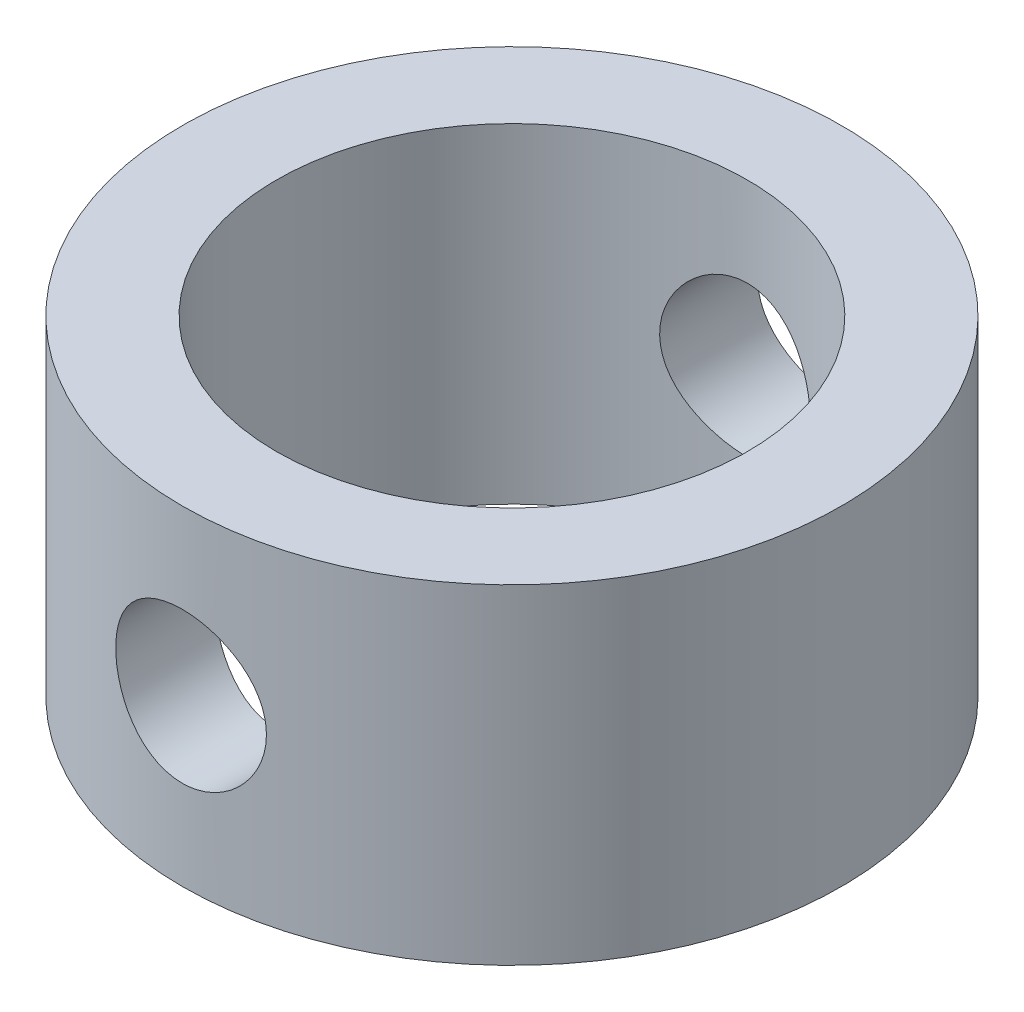
ISO-10303-21;
HEADER;
FILE_DESCRIPTION(('STEP AP214'),'2;1');
FILE_NAME('part.step','',(''),(''),'','','');
FILE_SCHEMA(('AUTOMOTIVE_DESIGN { 1 0 10303 214 1 1 1 1 }'));
ENDSEC;
DATA;
#1=APPLICATION_CONTEXT('core data for automotive mechanical design processes');
#2=APPLICATION_PROTOCOL_DEFINITION('international standard','automotive_design',2000,#1);
#3=PRODUCT_CONTEXT('',#1,'mechanical');
#4=PRODUCT('Part','Part','',(#3));
#5=PRODUCT_RELATED_PRODUCT_CATEGORY('part','',(#4));
#6=PRODUCT_DEFINITION_FORMATION('','',#4);
#7=PRODUCT_DEFINITION_CONTEXT('part definition',#1,'design');
#8=PRODUCT_DEFINITION('design','',#6,#7);
#9=PRODUCT_DEFINITION_SHAPE('','',#8);
#10=(LENGTH_UNIT() NAMED_UNIT(*) SI_UNIT(.MILLI.,.METRE.));
#11=(NAMED_UNIT(*) PLANE_ANGLE_UNIT() SI_UNIT($,.RADIAN.));
#12=(NAMED_UNIT(*) SI_UNIT($,.STERADIAN.) SOLID_ANGLE_UNIT());
#13=UNCERTAINTY_MEASURE_WITH_UNIT(LENGTH_MEASURE(1.E-05),#10,'distance_accuracy_value','');
#14=(GEOMETRIC_REPRESENTATION_CONTEXT(3) GLOBAL_UNCERTAINTY_ASSIGNED_CONTEXT((#13)) GLOBAL_UNIT_ASSIGNED_CONTEXT((#10,
#11,#12)) REPRESENTATION_CONTEXT('',''));
#15=CARTESIAN_POINT('',(0.,0.,0.));
#16=DIRECTION('',(0.,0.,1.));
#17=DIRECTION('',(1.,0.,0.));
#18=AXIS2_PLACEMENT_3D('',#15,#16,#17);
#19=CARTESIAN_POINT('',(0.,7.,0.));
#20=DIRECTION('',(0.,1.,0.));
#21=DIRECTION('',(0.,0.,1.));
#22=AXIS2_PLACEMENT_3D('',#19,#20,#21);
#23=PLANE('',#22);
#24=CARTESIAN_POINT('',(0.,7.,0.));
#25=DIRECTION('',(0.,1.,0.));
#26=DIRECTION('',(0.,0.,1.));
#27=AXIS2_PLACEMENT_3D('',#24,#25,#26);
#28=CIRCLE('',#27,7.);
#29=CARTESIAN_POINT('',(0.,7.,7.));
#30=VERTEX_POINT('',#29);
#31=EDGE_CURVE('E10',#30,#30,#28,.T.);
#32=ORIENTED_EDGE('',*,*,#31,.T.);
#33=EDGE_LOOP('',(#32));
#34=FACE_BOUND('',#33,.T.);
#35=CARTESIAN_POINT('',(0.,7.,0.));
#36=DIRECTION('',(0.,1.,0.));
#37=DIRECTION('',(0.,0.,1.));
#38=AXIS2_PLACEMENT_3D('',#35,#36,#37);
#39=CIRCLE('',#38,5.);
#40=CARTESIAN_POINT('',(0.,7.,5.));
#41=VERTEX_POINT('',#40);
#42=EDGE_CURVE('E56',#41,#41,#39,.T.);
#43=ORIENTED_EDGE('',*,*,#42,.F.);
#44=EDGE_LOOP('',(#43));
#45=FACE_BOUND('',#44,.T.);
#46=ADVANCED_FACE('F37',(#34,#45),#23,.T.);
#47=CARTESIAN_POINT('',(0.,0.,0.));
#48=DIRECTION('',(0.,1.,0.));
#49=DIRECTION('',(0.,0.,1.));
#50=AXIS2_PLACEMENT_3D('',#47,#48,#49);
#51=PLANE('',#50);
#52=CARTESIAN_POINT('',(0.,0.,0.));
#53=DIRECTION('',(0.,1.,0.));
#54=DIRECTION('',(0.,0.,1.));
#55=AXIS2_PLACEMENT_3D('',#52,#53,#54);
#56=CIRCLE('',#55,7.);
#57=CARTESIAN_POINT('',(0.,0.,7.));
#58=VERTEX_POINT('',#57);
#59=EDGE_CURVE('E51',#58,#58,#56,.T.);
#60=ORIENTED_EDGE('',*,*,#59,.F.);
#61=EDGE_LOOP('',(#60));
#62=FACE_BOUND('',#61,.T.);
#63=CARTESIAN_POINT('',(0.,0.,0.));
#64=DIRECTION('',(0.,1.,0.));
#65=DIRECTION('',(0.,0.,1.));
#66=AXIS2_PLACEMENT_3D('',#63,#64,#65);
#67=CIRCLE('',#66,5.);
#68=CARTESIAN_POINT('',(0.,0.,5.));
#69=VERTEX_POINT('',#68);
#70=EDGE_CURVE('E59',#69,#69,#67,.T.);
#71=ORIENTED_EDGE('',*,*,#70,.T.);
#72=EDGE_LOOP('',(#71));
#73=FACE_BOUND('',#72,.T.);
#74=ADVANCED_FACE('F95',(#62,#73),#51,.F.);
#75=CARTESIAN_POINT('',(0.,7.,0.));
#76=DIRECTION('',(0.,-1.,0.));
#77=DIRECTION('',(0.,0.,-1.));
#78=AXIS2_PLACEMENT_3D('',#75,#76,#77);
#79=CYLINDRICAL_SURFACE('',#78,7.);
#80=CARTESIAN_POINT('',(0.,5.1,-7.));
#81=CARTESIAN_POINT('',(-0.0886379741131132,5.09999712063702,-6.9999983872272));
#82=CARTESIAN_POINT('',(-0.177309902783651,5.09260950611361,-6.9982994143405));
#83=CARTESIAN_POINT('',(-0.352128208516269,5.06328898689009,-6.99168612205081));
#84=CARTESIAN_POINT('',(-0.43827285321298,5.04134633773801,-6.98676964859253));
#85=CARTESIAN_POINT('',(-0.605485442643028,4.98364434500204,-6.97426787089279));
#86=CARTESIAN_POINT('',(-0.686558820616922,4.94790009331745,-6.96668548260668));
#87=CARTESIAN_POINT('',(-0.841556086538906,4.86365905251279,-6.94966694289326));
#88=CARTESIAN_POINT('',(-0.915480028205752,4.81516235922098,-6.94023080539608));
#89=CARTESIAN_POINT('',(-1.05537027504478,4.70589911606378,-6.92035181193555));
#90=CARTESIAN_POINT('',(-1.12119415882717,4.64495265254023,-6.90989552728095));
#91=CARTESIAN_POINT('',(-1.24177996460575,4.51290584425307,-6.88924768150588));
#92=CARTESIAN_POINT('',(-1.29654082601189,4.44180452707802,-6.87905614584792));
#93=CARTESIAN_POINT('',(-1.39408692819904,4.29039737514567,-6.85995847893104));
#94=CARTESIAN_POINT('',(-1.43671823416616,4.20999000669604,-6.85106950982719));
#95=CARTESIAN_POINT('',(-1.5078069253594,4.04291525135802,-6.83577715386942));
#96=CARTESIAN_POINT('',(-1.53626617417339,3.95624868925405,-6.82937344023545));
#97=CARTESIAN_POINT('',(-1.57772761045187,3.78066723926141,-6.81991381908383));
#98=CARTESIAN_POINT('',(-1.59098317235358,3.69181520037621,-6.81680310247685));
#99=CARTESIAN_POINT('',(-1.60244923054371,3.5130981684293,-6.81411724511115));
#100=CARTESIAN_POINT('',(-1.60066175338077,3.42323331343974,-6.81454162811538));
#101=CARTESIAN_POINT('',(-1.58229584564285,3.24694243245445,-6.81882850388362));
#102=CARTESIAN_POINT('',(-1.56601399284799,3.16048357627982,-6.82262205453539));
#103=CARTESIAN_POINT('',(-1.51959235839624,2.99155802536655,-6.83311056805478));
#104=CARTESIAN_POINT('',(-1.48945173544396,2.9090915733224,-6.83980570706166));
#105=CARTESIAN_POINT('',(-1.41590179551202,2.74966965412771,-6.85540954631912));
#106=CARTESIAN_POINT('',(-1.37238038511702,2.67276779582619,-6.86433682288867));
#107=CARTESIAN_POINT('',(-1.27338296370284,2.52724989794081,-6.88338794534674));
#108=CARTESIAN_POINT('',(-1.21790518201741,2.45863508796973,-6.89351196836579));
#109=CARTESIAN_POINT('',(-1.09501002026373,2.32993380486209,-6.91411002021802));
#110=CARTESIAN_POINT('',(-1.02734100537028,2.27008777553052,-6.9245866600269));
#111=CARTESIAN_POINT('',(-0.882806184871843,2.16255215786154,-6.94449181379644));
#112=CARTESIAN_POINT('',(-0.805940181600775,2.11486283087078,-6.95392030522139));
#113=CARTESIAN_POINT('',(-0.644884971232094,2.03292637438192,-6.97070200113656));
#114=CARTESIAN_POINT('',(-0.560678003712239,1.99871301601305,-6.9780499790254));
#115=CARTESIAN_POINT('',(-0.387504234089222,1.94499013242032,-6.98980420293078));
#116=CARTESIAN_POINT('',(-0.298538191835776,1.92547826736727,-6.99421091705401));
#117=CARTESIAN_POINT('',(-0.120432095757171,1.90206720843723,-6.99951866685356));
#118=CARTESIAN_POINT('',(-0.0313373087821693,1.89783988357031,-7.00049336935576));
#119=CARTESIAN_POINT('',(0.146285614410675,1.90422533172909,-6.99903472580627));
#120=CARTESIAN_POINT('',(0.234813792308923,1.91483700027908,-6.99660163339889));
#121=CARTESIAN_POINT('',(0.407687313080899,1.95032752806721,-6.98864749841626));
#122=CARTESIAN_POINT('',(0.492070307479888,1.97503219614505,-6.98316417724177));
#123=CARTESIAN_POINT('',(0.655493499456105,2.03781241630652,-6.96972431623483));
#124=CARTESIAN_POINT('',(0.734533213316244,2.07588917701264,-6.96176755285037));
#125=CARTESIAN_POINT('',(0.886367687251043,2.16500189403043,-6.94408308005348));
#126=CARTESIAN_POINT('',(0.95904787776032,2.21622791915552,-6.93433004627506));
#127=CARTESIAN_POINT('',(1.09489796862016,2.32993702918679,-6.91418274262074));
#128=CARTESIAN_POINT('',(1.15806650959624,2.39242172034769,-6.90378838138707));
#129=CARTESIAN_POINT('',(1.27441433415695,2.528386105343,-6.88327217052232));
#130=CARTESIAN_POINT('',(1.32736542436474,2.6020628306583,-6.87316010202361));
#131=CARTESIAN_POINT('',(1.4201456867376,2.75745471149769,-6.85459217937569));
#132=CARTESIAN_POINT('',(1.45997544034786,2.83916951062255,-6.84613625184471));
#133=CARTESIAN_POINT('',(1.52510233475196,3.00787299808894,-6.83192320943003));
#134=CARTESIAN_POINT('',(1.55048352621184,3.09482786136428,-6.8261505223237));
#135=CARTESIAN_POINT('',(1.58623294768792,3.27191882163404,-6.81793280308828));
#136=CARTESIAN_POINT('',(1.59660383590366,3.36205435246184,-6.81548718176819));
#137=CARTESIAN_POINT('',(1.60191713966864,3.54064120916406,-6.81424002220294));
#138=CARTESIAN_POINT('',(1.59722216322636,3.62908133784989,-6.81535283659213));
#139=CARTESIAN_POINT('',(1.57335344851474,3.80387396035773,-6.82090215933048));
#140=CARTESIAN_POINT('',(1.55417991450031,3.89022648361271,-6.8253386207916));
#141=CARTESIAN_POINT('',(1.50208069867066,4.05807261594063,-6.83699174905262));
#142=CARTESIAN_POINT('',(1.46921240079544,4.13958489703376,-6.84419680517553));
#143=CARTESIAN_POINT('',(1.39070434633883,4.29599031868306,-6.86057886631993));
#144=CARTESIAN_POINT('',(1.34506312066392,4.37088269653858,-6.86975609814535));
#145=CARTESIAN_POINT('',(1.24112205369901,4.51369946648737,-6.88930081822239));
#146=CARTESIAN_POINT('',(1.18256580162533,4.5814343038109,-6.89969005119125));
#147=CARTESIAN_POINT('',(1.05497064314005,4.70623495961029,-6.92034723727384));
#148=CARTESIAN_POINT('',(0.985929302056401,4.76329829324299,-6.93061516162092));
#149=CARTESIAN_POINT('',(0.838120123652075,4.8659307513684,-6.95004925533688));
#150=CARTESIAN_POINT('',(0.75922611283224,4.91132179878929,-6.95919735284637));
#151=CARTESIAN_POINT('',(0.594732358167686,4.98812581696548,-6.97517728336576));
#152=CARTESIAN_POINT('',(0.509138061656778,5.019550006778,-6.98201097439818));
#153=CARTESIAN_POINT('',(0.35293728925528,5.06220555554414,-6.99143480981195));
#154=CARTESIAN_POINT('',(0.283148003366603,5.07635038673337,-6.9946262247138));
#155=CARTESIAN_POINT('',(0.142246387986996,5.09524851789942,-6.99890941185625));
#156=CARTESIAN_POINT('',(0.0711341281292465,5.10000231075876,-7.00000129428936));
#157=CARTESIAN_POINT('',(0.,5.1,-7.));
#158=B_SPLINE_CURVE_WITH_KNOTS('',3,(#80,#81,#82,#83,#84,#85,#86,#87,#88,#89,#90,#91,#92,#93,
#94,#95,#96,#97,#98,#99,#100,#101,#102,#103,#104,#105,#106,#107,#108,#109,#110,#111,#112,#113,
#114,#115,#116,#117,#118,#119,#120,#121,#122,#123,#124,#125,#126,#127,#128,#129,#130,#131,#132,
#133,#134,#135,#136,#137,#138,#139,#140,#141,#142,#143,#144,#145,#146,#147,#148,#149,#150,#151,
#152,#153,#154,#155,#156,#157),.UNSPECIFIED.,.T.,.F.,(4,2,2,2,2,2,2,2,2,2,2,2,2,2,2,2,2,2,2,2,2,
2,2,2,2,2,2,2,2,2,2,2,2,2,2,2,2,2,4),(0.,0.265653454780167,0.531484941673851,0.797026564255705,
1.06256619148108,1.33225579298312,1.60197123683722,1.87497075796352,2.14793437089225,
2.41627965691394,2.68458879292178,2.94753095692228,3.21048908491089,3.47571302204904,
3.74097626427093,4.01252133545154,4.28407224385747,4.55629940094895,4.82848322232888,
5.09478785937701,5.36107267625685,5.62413536437477,5.88722183525805,6.15434929210437,
6.42151488978987,6.69409075828748,6.96665454651788,7.23761612493487,7.50852971244204,
7.77297224843263,8.03741105389427,8.30075277457335,8.56412479627137,8.83329128913868,
9.10252037918336,9.37564127946973,9.64854239364143,9.86174693668258,10.0749402895247),.UNSPECIFIED.);
#159=CARTESIAN_POINT('',(0.,5.1,-7.));
#160=VERTEX_POINT('',#159);
#161=EDGE_CURVE('E84',#160,#160,#158,.T.);
#162=ORIENTED_EDGE('',*,*,#161,.T.);
#163=EDGE_LOOP('',(#162));
#164=FACE_BOUND('',#163,.T.);
#165=CARTESIAN_POINT('',(1.6,3.5,6.81469001496033));
#166=CARTESIAN_POINT('',(1.59999709736808,3.41139612555877,6.81469179715853));
#167=CARTESIAN_POINT('',(1.59261497234887,3.3227582413839,6.81643687963588));
#168=CARTESIAN_POINT('',(1.56331823119277,3.14801059265021,6.8232143477094));
#169=CARTESIAN_POINT('',(1.54139373101997,3.06190258917565,6.82824896907615));
#170=CARTESIAN_POINT('',(1.48374478473223,2.89476765841397,6.84100620359811));
#171=CARTESIAN_POINT('',(1.44803627975969,2.81373498688677,6.84872571067746));
#172=CARTESIAN_POINT('',(1.3638795396754,2.65880652778177,6.86597915036756));
#173=CARTESIAN_POINT('',(1.31543132078893,2.58491073111462,6.87551308066746));
#174=CARTESIAN_POINT('',(1.2062181020236,2.44499122661819,6.89551755429691));
#175=CARTESIAN_POINT('',(1.14526228566129,2.37911827701825,6.90600100133703));
#176=CARTESIAN_POINT('',(1.01317585144606,2.25843705518164,6.92661063962017));
#177=CARTESIAN_POINT('',(0.942044397445645,2.2036296931143,6.93673680141921));
#178=CARTESIAN_POINT('',(0.790608349585351,2.10603287797322,6.95563214745422));
#179=CARTESIAN_POINT('',(0.710207393048277,2.06338937037771,6.9643843284392));
#180=CARTESIAN_POINT('',(0.543146446171637,1.99227638324751,6.97939938180261));
#181=CARTESIAN_POINT('',(0.456487225637286,1.96380516382261,6.98566255972958));
#182=CARTESIAN_POINT('',(0.280938591025047,1.9223217535438,6.99490272025626));
#183=CARTESIAN_POINT('',(0.192112439768601,1.9090541344855,6.99793393900028));
#184=CARTESIAN_POINT('',(0.0134468624739942,1.89755497591603,7.00055688588394));
#185=CARTESIAN_POINT('',(-0.0763924360384377,1.89932156467389,7.00014904218053));
#186=CARTESIAN_POINT('',(-0.25277004973355,1.91765239968232,6.99598094360316));
#187=CARTESIAN_POINT('',(-0.339338683481535,1.93394121468841,6.99228309034161));
#188=CARTESIAN_POINT('',(-0.508480098919908,1.98041406948084,6.9820220198796));
#189=CARTESIAN_POINT('',(-0.59105268921179,2.01059877411215,6.97545866558082));
#190=CARTESIAN_POINT('',(-0.750610898693721,2.084243862576,6.9601051663516));
#191=CARTESIAN_POINT('',(-0.827547512636427,2.12780671051103,6.95129792730382));
#192=CARTESIAN_POINT('',(-0.973117775688686,2.2268947203015,6.93241931713112));
#193=CARTESIAN_POINT('',(-1.0417501950334,2.28242165053562,6.9223477592226));
#194=CARTESIAN_POINT('',(-1.17040358898237,2.40535440446728,6.90177529048974));
#195=CARTESIAN_POINT('',(-1.23019377228362,2.47300122340896,6.89126982299882));
#196=CARTESIAN_POINT('',(-1.33762692365175,2.61747085756795,6.87122620342537));
#197=CARTESIAN_POINT('',(-1.38526949808464,2.69429397001763,6.86168808269499));
#198=CARTESIAN_POINT('',(-1.46717089296347,2.85533231905333,6.8446456319174));
#199=CARTESIAN_POINT('',(-1.50138253765342,2.93957236153277,6.83714849854336));
#200=CARTESIAN_POINT('',(-1.55509212795409,3.11281874253011,6.82513398418271));
#201=CARTESIAN_POINT('',(-1.57459264737369,3.20182424437962,6.82061608197728));
#202=CARTESIAN_POINT('',(-1.59796102519681,3.37995663747457,6.81517884183384));
#203=CARTESIAN_POINT('',(-1.60216649364562,3.46903691995179,6.81418180196348));
#204=CARTESIAN_POINT('',(-1.59574253134773,3.64662581404689,6.81568899343857));
#205=CARTESIAN_POINT('',(-1.58511422180256,3.73513446836294,6.81819296016271));
#206=CARTESIAN_POINT('',(-1.54961829979933,3.90786889229546,6.82634632273278));
#207=CARTESIAN_POINT('',(-1.52493979938911,3.99213568038934,6.83195391714633));
#208=CARTESIAN_POINT('',(-1.46225025256673,4.15533788964084,6.84564439549244));
#209=CARTESIAN_POINT('',(-1.42423783502849,4.2342727615219,6.85372753397422));
#210=CARTESIAN_POINT('',(-1.33522697108299,4.38602230813927,6.87162689834418));
#211=CARTESIAN_POINT('',(-1.2840223930059,4.45871286136946,6.88146979578541));
#212=CARTESIAN_POINT('',(-1.17034766486632,4.59459364754845,6.90171081027447));
#213=CARTESIAN_POINT('',(-1.10787598034324,4.65778258432562,6.91210900281166));
#214=CARTESIAN_POINT('',(-0.9719060064303,4.77419400316028,6.93254731147132));
#215=CARTESIAN_POINT('',(-0.898207694681042,4.8271852754361,6.94257569579928));
#216=CARTESIAN_POINT('',(-0.742760022311862,4.92003603926323,6.96092116487175));
#217=CARTESIAN_POINT('',(-0.661011054901408,4.95989617175181,6.96923833313411));
#218=CARTESIAN_POINT('',(-0.492313619920363,5.02503977191364,6.98317517183665));
#219=CARTESIAN_POINT('',(-0.405404097125808,5.05042009084312,6.98881272205821));
#220=CARTESIAN_POINT('',(-0.228410332989493,5.08618305095036,6.99683275004727));
#221=CARTESIAN_POINT('',(-0.138326600472714,5.09656808476523,6.99921574710569));
#222=CARTESIAN_POINT('',(0.0402706786919383,5.10192986899149,7.00044100167939));
#223=CARTESIAN_POINT('',(0.128773529474695,5.0972505603617,6.99936229671335));
#224=CARTESIAN_POINT('',(0.303695843309095,5.07339136858875,6.99395647482339));
#225=CARTESIAN_POINT('',(0.390115350681832,5.05421179420598,6.98962942706783));
#226=CARTESIAN_POINT('',(0.5581232486924,5.00206758740993,6.9782209304589));
#227=CARTESIAN_POINT('',(0.6397288147476,4.96915583240545,6.97115005427693));
#228=CARTESIAN_POINT('',(0.796303190685655,4.89053157705727,6.95500562785345));
#229=CARTESIAN_POINT('',(0.871271293132578,4.84481771439235,6.94593186449884));
#230=CARTESIAN_POINT('',(1.01410673979345,4.74078722304496,6.92653554690011));
#231=CARTESIAN_POINT('',(1.08179678380191,4.68223120716924,6.91619118593872));
#232=CARTESIAN_POINT('',(1.20650719781638,4.55465611414911,6.89553082445679));
#233=CARTESIAN_POINT('',(1.26352495823679,4.48563448540281,6.88521483147878));
#234=CARTESIAN_POINT('',(1.36609616836194,4.33784968316404,6.86560672769905));
#235=CARTESIAN_POINT('',(1.41146610794338,4.25895666465997,6.85633216637138));
#236=CARTESIAN_POINT('',(1.48823092123963,4.09446756929687,6.84008185961926));
#237=CARTESIAN_POINT('',(1.5196371340644,4.00887699779165,6.83310425017701));
#238=CARTESIAN_POINT('',(1.56225215278002,3.85272116663267,6.82346893621693));
#239=CARTESIAN_POINT('',(1.57637937528388,3.78297546711418,6.8201995396797));
#240=CARTESIAN_POINT('',(1.59525419015177,3.64216042489466,6.81580942666472));
#241=CARTESIAN_POINT('',(1.60000232892151,3.5710911595453,6.8146885850168));
#242=CARTESIAN_POINT('',(1.6,3.5,6.81469001496033));
#243=B_SPLINE_CURVE_WITH_KNOTS('',3,(#165,#166,#167,#168,#169,#170,#171,#172,#173,#174,#175,
#176,#177,#178,#179,#180,#181,#182,#183,#184,#185,#186,#187,#188,#189,#190,#191,#192,#193,#194,
#195,#196,#197,#198,#199,#200,#201,#202,#203,#204,#205,#206,#207,#208,#209,#210,#211,#212,#213,
#214,#215,#216,#217,#218,#219,#220,#221,#222,#223,#224,#225,#226,#227,#228,#229,#230,#231,#232,
#233,#234,#235,#236,#237,#238,#239,#240,#241,#242),.UNSPECIFIED.,.T.,.F.,(4,2,2,2,2,2,2,2,2,2,2,
2,2,2,2,2,2,2,2,2,2,2,2,2,2,2,2,2,2,2,2,2,2,2,2,2,2,2,4),(0.,0.265550929625293,0.53128253180986,
0.796707732830638,1.06213259580778,1.33195628233361,1.60180215342771,1.87476123374527,
2.14768679540813,2.41595655701147,2.68419292001622,2.94744760055056,3.21071487774078,
3.47605106683957,3.74142650149999,4.01282473446083,4.28423176075699,4.55658374500069,
4.82888806840132,5.09514399753771,5.36137980298104,5.62411410622947,5.88687543435774,
6.15402187766377,6.42120473099733,6.6938721152285,6.96652618846026,7.23733450742321,
7.50809961162519,7.77272697224116,8.03734869819176,8.3009607351994,8.56460083483803,
8.83365149758014,9.10276786286102,9.37589474441858,9.64879942902785,9.86187615431145,
10.0749404658266),.UNSPECIFIED.);
#244=CARTESIAN_POINT('',(1.6,3.5,6.81469001496033));
#245=VERTEX_POINT('',#244);
#246=EDGE_CURVE('E79',#245,#245,#243,.T.);
#247=ORIENTED_EDGE('',*,*,#246,.T.);
#248=EDGE_LOOP('',(#247));
#249=FACE_BOUND('',#248,.T.);
#250=ORIENTED_EDGE('',*,*,#31,.F.);
#251=EDGE_LOOP('',(#250));
#252=FACE_BOUND('',#251,.T.);
#253=ORIENTED_EDGE('',*,*,#59,.T.);
#254=EDGE_LOOP('',(#253));
#255=FACE_BOUND('',#254,.T.);
#256=ADVANCED_FACE('F39',(#164,#249,#252,#255),#79,.T.);
#257=CARTESIAN_POINT('',(0.,7.,0.));
#258=DIRECTION('',(0.,-1.,0.));
#259=DIRECTION('',(0.,0.,-1.));
#260=AXIS2_PLACEMENT_3D('',#257,#258,#259);
#261=CYLINDRICAL_SURFACE('',#260,5.);
#262=CARTESIAN_POINT('',(0.,5.1,-5.));
#263=CARTESIAN_POINT('',(-0.0874958063159797,5.09999975634942,-4.99999978543627));
#264=CARTESIAN_POINT('',(-0.174994637059061,5.09279940472074,-4.99768184156355));
#265=CARTESIAN_POINT('',(-0.347426901237483,5.06426818047074,-4.98866262172227));
#266=CARTESIAN_POINT('',(-0.432359863373708,5.04293472818209,-4.98196054553558));
#267=CARTESIAN_POINT('',(-0.597149225791565,4.98693507878823,-4.9649038363541));
#268=CARTESIAN_POINT('',(-0.677013473384595,4.9522901076294,-4.95455502045191));
#269=CARTESIAN_POINT('',(-0.829798762851157,4.87074316991274,-4.93126901642872));
#270=CARTESIAN_POINT('',(-0.902718607024946,4.82383909423439,-4.91833138300386));
#271=CARTESIAN_POINT('',(-1.04189475779498,4.71751588649597,-4.89077067933825));
#272=CARTESIAN_POINT('',(-1.1078960922464,4.65777290104658,-4.87610957732918));
#273=CARTESIAN_POINT('',(-1.22913423693228,4.52815693345259,-4.8469706570307));
#274=CARTESIAN_POINT('',(-1.28436891793797,4.45828195234513,-4.83249287552328));
#275=CARTESIAN_POINT('',(-1.38391395073831,4.30814714548961,-4.80494810799029));
#276=CARTESIAN_POINT('',(-1.42790123109944,4.22766371872946,-4.79192785635417));
#277=CARTESIAN_POINT('',(-1.5016091713459,4.05995765622989,-4.76934657798646));
#278=CARTESIAN_POINT('',(-1.53133379773326,3.97273690201169,-4.75978458968016));
#279=CARTESIAN_POINT('',(-1.57473134311321,3.79691739272712,-4.74560122760597));
#280=CARTESIAN_POINT('',(-1.58887896846385,3.70844789824797,-4.74083414932744));
#281=CARTESIAN_POINT('',(-1.60220433058851,3.53027240081554,-4.73634831045));
#282=CARTESIAN_POINT('',(-1.6013862709372,3.44056675214803,-4.73662813227306));
#283=CARTESIAN_POINT('',(-1.58517380736381,3.26643441511176,-4.74207619100075));
#284=CARTESIAN_POINT('',(-1.57038842132725,3.1819435465553,-4.7470401743042));
#285=CARTESIAN_POINT('',(-1.52765058974139,3.01671115557794,-4.76096457446162));
#286=CARTESIAN_POINT('',(-1.49969668269327,2.9359700504148,-4.76992543490025));
#287=CARTESIAN_POINT('',(-1.43099645158812,2.77910214117426,-4.7909865416364));
#288=CARTESIAN_POINT('',(-1.39006273103722,2.70306378004852,-4.80313229469362));
#289=CARTESIAN_POINT('',(-1.29669494334068,2.55873795697323,-4.82917444861168));
#290=CARTESIAN_POINT('',(-1.24425776827155,2.49045259725646,-4.8430713221454));
#291=CARTESIAN_POINT('',(-1.12640551540387,2.36013532713372,-4.87186372141871));
#292=CARTESIAN_POINT('',(-1.06048936249402,2.29855922306119,-4.8867752080818));
#293=CARTESIAN_POINT('',(-0.919081432217149,2.18722132176635,-4.91533168114877));
#294=CARTESIAN_POINT('',(-0.843588875652695,2.13746048685711,-4.92897656433707));
#295=CARTESIAN_POINT('',(-0.684261580712375,2.05083655671978,-4.95361789744584));
#296=CARTESIAN_POINT('',(-0.600361279440636,2.01408689916357,-4.96459080547942));
#297=CARTESIAN_POINT('',(-0.427135850361131,1.95536040333729,-4.98248161100196));
#298=CARTESIAN_POINT('',(-0.337812463131548,1.93337885218328,-4.98940080204637));
#299=CARTESIAN_POINT('',(-0.160141789589318,1.90559993333478,-4.99819424239135));
#300=CARTESIAN_POINT('',(-0.0719002860170734,1.8991859263889,-5.00026060178154));
#301=CARTESIAN_POINT('',(0.104410269588106,1.9009792182213,-4.99968655318444));
#302=CARTESIAN_POINT('',(0.19247934608744,1.90918426530988,-4.99704687004206));
#303=CARTESIAN_POINT('',(0.363535018203812,1.93949011308117,-4.98748380317497));
#304=CARTESIAN_POINT('',(0.446594362478023,1.9612199100859,-4.98067486649266));
#305=CARTESIAN_POINT('',(0.607861654600583,2.01750179939625,-4.96357585995349));
#306=CARTESIAN_POINT('',(0.686068993794125,2.05205549660218,-4.95328535439547));
#307=CARTESIAN_POINT('',(0.837596923870445,2.13397101717815,-4.92995531019905));
#308=CARTESIAN_POINT('',(0.910745620500967,2.1816325119423,-4.9168532627009));
#309=CARTESIAN_POINT('',(1.04821150300662,2.28805387298564,-4.8893940824048));
#310=CARTESIAN_POINT('',(1.11252617555398,2.3468168864583,-4.87503659432078));
#311=CARTESIAN_POINT('',(1.23328321488635,2.47667415961096,-4.84592967283237));
#312=CARTESIAN_POINT('',(1.2892857947562,2.54818026768848,-4.83118884166735));
#313=CARTESIAN_POINT('',(1.38854141992569,2.69989467445821,-4.80360443110145));
#314=CARTESIAN_POINT('',(1.43179457025642,2.78010290145405,-4.79076083607138));
#315=CARTESIAN_POINT('',(1.50407580301231,2.94684357865608,-4.76856262886575));
#316=CARTESIAN_POINT('',(1.53315066307446,3.03335413498969,-4.75919656820051));
#317=CARTESIAN_POINT('',(1.57620668246201,3.21040720981033,-4.74511281699328));
#318=CARTESIAN_POINT('',(1.59019395006567,3.30094808113599,-4.74039324536734));
#319=CARTESIAN_POINT('',(1.60222535311566,3.47887596916399,-4.73633927898768));
#320=CARTESIAN_POINT('',(1.60099388446006,3.56620901132899,-4.73676019091382));
#321=CARTESIAN_POINT('',(1.5843835514937,3.7393570054347,-4.74234159093745));
#322=CARTESIAN_POINT('',(1.56900540861121,3.82517203456103,-4.74750183734632));
#323=CARTESIAN_POINT('',(1.52503332416461,3.99148342537688,-4.76180543144416));
#324=CARTESIAN_POINT('',(1.49665627942706,4.07204319889287,-4.77088327236763));
#325=CARTESIAN_POINT('',(1.42766427484382,4.22732176040081,-4.79197975594362));
#326=CARTESIAN_POINT('',(1.38704674114626,4.3020393157627,-4.8039990169992));
#327=CARTESIAN_POINT('',(1.29279266707432,4.44680962981441,-4.83023494368376));
#328=CARTESIAN_POINT('',(1.23869308431578,4.51654826273405,-4.8445211905268));
#329=CARTESIAN_POINT('',(1.11981399792884,4.64619174582096,-4.87337180847353));
#330=CARTESIAN_POINT('',(1.05503158166823,4.70609390519865,-4.88793625446696));
#331=CARTESIAN_POINT('',(0.913912210298351,4.81645828592383,-4.91631108200117));
#332=CARTESIAN_POINT('',(0.83725135176078,4.86651895188431,-4.93007751880386));
#333=CARTESIAN_POINT('',(0.676163529926937,4.95298018809723,-4.95473787697861));
#334=CARTESIAN_POINT('',(0.591739263208157,4.9893854793208,-4.96563279071293));
#335=CARTESIAN_POINT('',(0.423663431644845,5.04524777983044,-4.98268341064065));
#336=CARTESIAN_POINT('',(0.34037676648733,5.06571845058311,-4.98911901301451));
#337=CARTESIAN_POINT('',(0.171394001076119,5.09309314290401,-4.99777693541394));
#338=CARTESIAN_POINT('',(0.0856984512613946,5.10000023864547,-5.00000021015613));
#339=CARTESIAN_POINT('',(0.,5.1,-5.));
#340=B_SPLINE_CURVE_WITH_KNOTS('',3,(#262,#263,#264,#265,#266,#267,#268,#269,#270,#271,#272,
#273,#274,#275,#276,#277,#278,#279,#280,#281,#282,#283,#284,#285,#286,#287,#288,#289,#290,#291,
#292,#293,#294,#295,#296,#297,#298,#299,#300,#301,#302,#303,#304,#305,#306,#307,#308,#309,#310,
#311,#312,#313,#314,#315,#316,#317,#318,#319,#320,#321,#322,#323,#324,#325,#326,#327,#328,#329,
#330,#331,#332,#333,#334,#335,#336,#337,#338,#339),.UNSPECIFIED.,.T.,.F.,(4,2,2,2,2,2,2,2,2,2,2,
2,2,2,2,2,2,2,2,2,2,2,2,2,2,2,2,2,2,2,2,2,2,2,2,2,2,2,4),(0.,0.262172289866487,
0.524392446348364,0.786196202111712,1.04804502964703,1.31749718151567,1.58700256668426,
1.86354828826627,2.14001705671955,2.40780489999507,2.67551752794224,2.93207089351445,
3.18865273918778,3.44912195934763,3.70966163813009,3.98267284808623,4.25570628624555,
4.53106471334194,4.80633522466348,5.07051010591344,5.33464430132699,5.59183416387789,
5.84905622438333,6.11273355055081,6.37648573964818,6.65122993053059,6.92597185797942,
7.19980110675104,7.47351945288796,7.73426134972847,7.99498995042988,8.25151822881316,
8.50810048600704,8.77513756675922,9.04224757485583,9.3186628553126,9.5949824844973,
9.85182740305347,10.1086141011961),.UNSPECIFIED.);
#341=CARTESIAN_POINT('',(0.,5.1,-5.));
#342=VERTEX_POINT('',#341);
#343=EDGE_CURVE('E42',#342,#342,#340,.T.);
#344=ORIENTED_EDGE('',*,*,#343,.F.);
#345=EDGE_LOOP('',(#344));
#346=FACE_BOUND('',#345,.T.);
#347=CARTESIAN_POINT('',(1.6,3.5,4.7370877129308));
#348=CARTESIAN_POINT('',(1.59999974373874,3.41263376201709,4.73708798780949));
#349=CARTESIAN_POINT('',(1.59281993166463,3.3252644962471,4.73953109593308));
#350=CARTESIAN_POINT('',(1.56437769172507,3.15310041237817,4.7489937190314));
#351=CARTESIAN_POINT('',(1.54311199666736,3.06830619633013,4.75601429573487));
#352=CARTESIAN_POINT('',(1.48731021882536,2.90381189835967,4.77375701461625));
#353=CARTESIAN_POINT('',(1.45279850166911,2.82410277469806,4.78447235673699));
#354=CARTESIAN_POINT('',(1.37156634454408,2.67158235897785,4.80838765550231));
#355=CARTESIAN_POINT('',(1.32484355228541,2.59877239963129,4.82158809072754));
#356=CARTESIAN_POINT('',(1.21871241953147,2.4594936048683,4.84951968764674));
#357=CARTESIAN_POINT('',(1.15893934729319,2.39330983452526,4.86428678030524));
#358=CARTESIAN_POINT('',(1.02918412233017,2.27171357413611,4.89338280213669));
#359=CARTESIAN_POINT('',(0.959200473487308,2.21630266537781,4.90771166672489));
#360=CARTESIAN_POINT('',(0.808949422462771,2.11655461470001,4.93472953085556));
#361=CARTESIAN_POINT('',(0.728476687860992,2.07251285069074,4.94737131144711));
#362=CARTESIAN_POINT('',(0.560792193508548,1.99870143603437,4.96916970645467));
#363=CARTESIAN_POINT('',(0.473582105406685,1.96892825823732,4.97832718206453));
#364=CARTESIAN_POINT('',(0.297884710119076,1.92545622077164,4.99187078015161));
#365=CARTESIAN_POINT('',(0.209529388874191,1.91126974233839,4.99640130994181));
#366=CARTESIAN_POINT('',(0.031584129920492,1.89782689449889,5.00069148119392));
#367=CARTESIAN_POINT('',(-0.0580055088308478,1.8985669711982,5.00045225829628));
#368=CARTESIAN_POINT('',(-0.232437491666959,1.91463950197237,4.9953294799159));
#369=CARTESIAN_POINT('',(-0.317334316303528,1.92944299784062,4.99061428137964));
#370=CARTESIAN_POINT('',(-0.483368293649631,1.97235182324115,4.97727793973528));
#371=CARTESIAN_POINT('',(-0.564505196993057,2.00045803365593,4.96865653796686));
#372=CARTESIAN_POINT('',(-0.721913949614886,2.06950323251782,4.94825462002066));
#373=CARTESIAN_POINT('',(-0.798111771873499,2.11059918159356,4.93643573330445));
#374=CARTESIAN_POINT('',(-0.94269143741114,2.20433020689855,4.9108788342044));
#375=CARTESIAN_POINT('',(-1.01107122500451,2.25696830747062,4.89714031917112));
#376=CARTESIAN_POINT('',(-1.14122552524351,2.37498764173318,4.86849469180912));
#377=CARTESIAN_POINT('',(-1.2025821378014,2.44082436305752,4.85356274482591));
#378=CARTESIAN_POINT('',(-1.31351207358059,2.5819882609796,4.8247258395209));
#379=CARTESIAN_POINT('',(-1.36308386476992,2.65731666955544,4.81082101488724));
#380=CARTESIAN_POINT('',(-1.44955524382539,2.81655674029327,4.78548357380621));
#381=CARTESIAN_POINT('',(-1.48629250439436,2.90056207537524,4.77408325840667));
#382=CARTESIAN_POINT('',(-1.54496461752815,3.07402080639224,4.75542251488665));
#383=CARTESIAN_POINT('',(-1.56690509705448,3.16347211719119,4.74816051319963));
#384=CARTESIAN_POINT('',(-1.59453893191269,3.34126391009053,4.73895031775712));
#385=CARTESIAN_POINT('',(-1.60087507754216,3.42949364832457,4.73679204354283));
#386=CARTESIAN_POINT('',(-1.59893067907134,3.60576427053874,4.73744898777772));
#387=CARTESIAN_POINT('',(-1.5906525297045,3.6938051830935,4.74026339139206));
#388=CARTESIAN_POINT('',(-1.56029013344713,3.86437702734367,4.7503404414304));
#389=CARTESIAN_POINT('',(-1.53863886571376,3.94699414669862,4.75746344492905));
#390=CARTESIAN_POINT('',(-1.48265712290061,4.10741115974012,4.77520515081817));
#391=CARTESIAN_POINT('',(-1.44832451458384,4.18521024037054,4.78582444131636));
#392=CARTESIAN_POINT('',(-1.3667895840503,4.33634784716175,4.80975442366493));
#393=CARTESIAN_POINT('',(-1.31923446955668,4.4094845588093,4.8231358439457));
#394=CARTESIAN_POINT('',(-1.2130119976528,4.5469734221838,4.85093919332853));
#395=CARTESIAN_POINT('',(-1.15434161483455,4.61132317400831,4.86536140505509));
#396=CARTESIAN_POINT('',(-1.02450097804918,4.7323191106342,4.89438512522789));
#397=CARTESIAN_POINT('',(-0.952895991490041,4.78850480158372,4.90896684906861));
#398=CARTESIAN_POINT('',(-0.800918884886268,4.88808507727672,4.93603865529218));
#399=CARTESIAN_POINT('',(-0.720547139344917,4.93148020812148,4.94852882696537));
#400=CARTESIAN_POINT('',(-0.55378376090426,5.00383599726771,4.96994289161967));
#401=CARTESIAN_POINT('',(-0.467439525556669,5.03289811841377,4.97889176140864));
#402=CARTESIAN_POINT('',(-0.290749982825202,5.07598410411073,4.9923242466308));
#403=CARTESIAN_POINT('',(-0.200406004983307,5.0900129273269,4.99680933438748));
#404=CARTESIAN_POINT('',(-0.0225106351625049,5.10221570789975,5.00070652519304));
#405=CARTESIAN_POINT('',(0.0649911044944393,5.10105331502989,5.00033097908979));
#406=CARTESIAN_POINT('',(0.238495437910279,5.08452291522177,4.99506275597099));
#407=CARTESIAN_POINT('',(0.324498137176767,5.06915591219964,4.99017039818283));
#408=CARTESIAN_POINT('',(0.491403041592258,5.02508172923404,4.97648934157747));
#409=CARTESIAN_POINT('',(0.572358868573165,4.99655962755433,4.96775477499445));
#410=CARTESIAN_POINT('',(0.728372537104162,4.92715339042773,4.9472892397229));
#411=CARTESIAN_POINT('',(0.80342934194862,4.88626708816543,4.93555774588147));
#412=CARTESIAN_POINT('',(0.94837785665468,4.79163889221453,4.90980554197593));
#413=CARTESIAN_POINT('',(1.01799645273276,4.73749676379537,4.89571902538267));
#414=CARTESIAN_POINT('',(1.14737920780259,4.61859072415985,4.86702383992102));
#415=CARTESIAN_POINT('',(1.20714033786284,4.55382356030674,4.85241501223218));
#416=CARTESIAN_POINT('',(1.31724196523931,4.41277335436299,4.82371532498013));
#417=CARTESIAN_POINT('',(1.36717640898326,4.33616499792533,4.80966084431258));
#418=CARTESIAN_POINT('',(1.45341388681981,4.17521529433033,4.78430967821654));
#419=CARTESIAN_POINT('',(1.48972176586893,4.09087670896938,4.77301201309667));
#420=CARTESIAN_POINT('',(1.5454160638658,3.92301715888516,4.75525868307298));
#421=CARTESIAN_POINT('',(1.56582251059464,3.83986484408344,4.74851573857385));
#422=CARTESIAN_POINT('',(1.59311272174624,3.67114220114767,4.73943073150288));
#423=CARTESIAN_POINT('',(1.60000025100005,3.58557255294307,4.73708744369556));
#424=CARTESIAN_POINT('',(1.6,3.5,4.7370877129308));
#425=B_SPLINE_CURVE_WITH_KNOTS('',3,(#347,#348,#349,#350,#351,#352,#353,#354,#355,#356,#357,
#358,#359,#360,#361,#362,#363,#364,#365,#366,#367,#368,#369,#370,#371,#372,#373,#374,#375,#376,
#377,#378,#379,#380,#381,#382,#383,#384,#385,#386,#387,#388,#389,#390,#391,#392,#393,#394,#395,
#396,#397,#398,#399,#400,#401,#402,#403,#404,#405,#406,#407,#408,#409,#410,#411,#412,#413,#414,
#415,#416,#417,#418,#419,#420,#421,#422,#423,#424),.UNSPECIFIED.,.T.,.F.,(4,2,2,2,2,2,2,2,2,2,2,
2,2,2,2,2,2,2,2,2,2,2,2,2,2,2,2,2,2,2,2,2,2,2,2,2,2,2,4),(0.,0.261782337086142,
0.523625415332401,0.784989132393395,1.04640323461352,1.31636217216967,1.58636070561341,
1.86279377491072,2.13915847552485,2.4066067441957,2.67399133630597,2.93170127402817,
3.18942827924008,3.45039690075846,3.71143398470616,3.98385068324257,4.25630277672778,
4.53208561817766,4.80776352492637,5.07187991332532,5.33595302699622,5.59189456344124,
5.84787917362796,6.1114865329221,6.37516574550518,6.65038672388641,6.92559594982594,
7.19882796886114,7.47196983578453,7.73322052820114,7.99445275803872,8.2521168587703,
8.50982614110574,8.77656491371796,9.04338549583877,9.3196060101,9.59572822026813,
9.85220743369916,10.1086152110862),.UNSPECIFIED.);
#426=CARTESIAN_POINT('',(1.6,3.5,4.7370877129308));
#427=VERTEX_POINT('',#426);
#428=EDGE_CURVE('E61',#427,#427,#425,.T.);
#429=ORIENTED_EDGE('',*,*,#428,.F.);
#430=EDGE_LOOP('',(#429));
#431=FACE_BOUND('',#430,.T.);
#432=ORIENTED_EDGE('',*,*,#42,.T.);
#433=EDGE_LOOP('',(#432));
#434=FACE_BOUND('',#433,.T.);
#435=ORIENTED_EDGE('',*,*,#70,.F.);
#436=EDGE_LOOP('',(#435));
#437=FACE_BOUND('',#436,.T.);
#438=ADVANCED_FACE('F66',(#346,#431,#434,#437),#261,.F.);
#439=CARTESIAN_POINT('',(0.,3.5,-7.));
#440=DIRECTION('',(0.,0.,1.));
#441=DIRECTION('',(1.,0.,0.));
#442=AXIS2_PLACEMENT_3D('',#439,#440,#441);
#443=CYLINDRICAL_SURFACE('',#442,1.6);
#444=ORIENTED_EDGE('',*,*,#428,.T.);
#445=EDGE_LOOP('',(#444));
#446=FACE_BOUND('',#445,.T.);
#447=ORIENTED_EDGE('',*,*,#246,.F.);
#448=EDGE_LOOP('',(#447));
#449=FACE_BOUND('',#448,.T.);
#450=ADVANCED_FACE('F72',(#446,#449),#443,.F.);
#451=ORIENTED_EDGE('',*,*,#343,.T.);
#452=EDGE_LOOP('',(#451));
#453=FACE_BOUND('',#452,.T.);
#454=ORIENTED_EDGE('',*,*,#161,.F.);
#455=EDGE_LOOP('',(#454));
#456=FACE_BOUND('',#455,.T.);
#457=ADVANCED_FACE('F69',(#453,#456),#443,.F.);
#458=CLOSED_SHELL('',(#46,#74,#256,#438,#450,#457));
#459=MANIFOLD_SOLID_BREP('B2',#458);
#460=ADVANCED_BREP_SHAPE_REPRESENTATION('',(#18,#459),#14);
#461=SHAPE_DEFINITION_REPRESENTATION(#9,#460);
ENDSEC;
END-ISO-10303-21;
